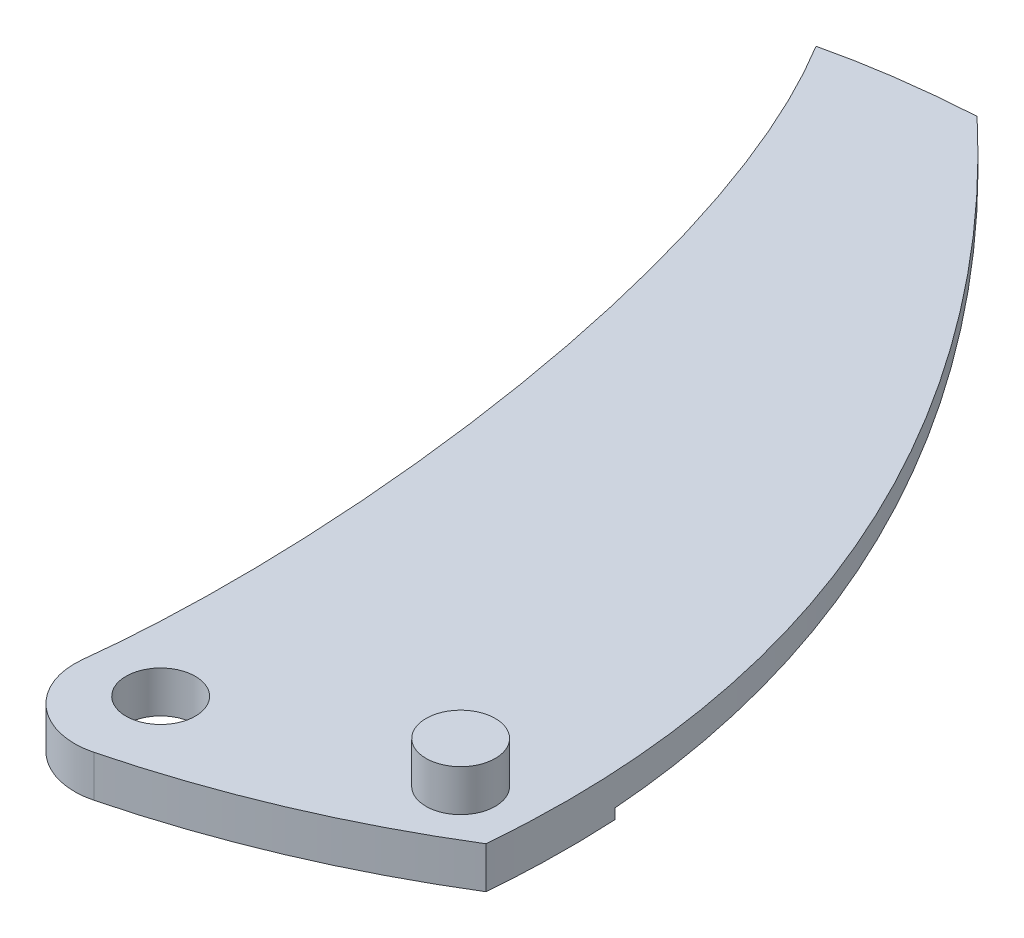
ISO-10303-21;
HEADER;
FILE_DESCRIPTION(('STEP AP214'),'2;1');
FILE_NAME('part.step','',(''),(''),'','','');
FILE_SCHEMA(('AUTOMOTIVE_DESIGN { 1 0 10303 214 1 1 1 1 }'));
ENDSEC;
DATA;
#1=APPLICATION_CONTEXT('core data for automotive mechanical design processes');
#2=APPLICATION_PROTOCOL_DEFINITION('international standard','automotive_design',2000,#1);
#3=PRODUCT_CONTEXT('',#1,'mechanical');
#4=PRODUCT('Part','Part','',(#3));
#5=PRODUCT_RELATED_PRODUCT_CATEGORY('part','',(#4));
#6=PRODUCT_DEFINITION_FORMATION('','',#4);
#7=PRODUCT_DEFINITION_CONTEXT('part definition',#1,'design');
#8=PRODUCT_DEFINITION('design','',#6,#7);
#9=PRODUCT_DEFINITION_SHAPE('','',#8);
#10=(LENGTH_UNIT() NAMED_UNIT(*) SI_UNIT(.MILLI.,.METRE.));
#11=(NAMED_UNIT(*) PLANE_ANGLE_UNIT() SI_UNIT($,.RADIAN.));
#12=(NAMED_UNIT(*) SI_UNIT($,.STERADIAN.) SOLID_ANGLE_UNIT());
#13=UNCERTAINTY_MEASURE_WITH_UNIT(LENGTH_MEASURE(1.E-05),#10,'distance_accuracy_value','');
#14=(GEOMETRIC_REPRESENTATION_CONTEXT(3) GLOBAL_UNCERTAINTY_ASSIGNED_CONTEXT((#13)) GLOBAL_UNIT_ASSIGNED_CONTEXT((#10,
#11,#12)) REPRESENTATION_CONTEXT('',''));
#15=CARTESIAN_POINT('',(0.,0.,0.));
#16=DIRECTION('',(0.,0.,1.));
#17=DIRECTION('',(1.,0.,0.));
#18=AXIS2_PLACEMENT_3D('',#15,#16,#17);
#19=CARTESIAN_POINT('',(71.4794551048972,3.,12.1217778360679));
#20=CARTESIAN_POINT('',(58.9107047890441,3.,3.5514220776926));
#21=CARTESIAN_POINT('',(21.9997651748603,3.,-5.2665547097315));
#22=CARTESIAN_POINT('',(0.,3.,0.));
#23=B_SPLINE_CURVE_WITH_KNOTS('',3,(#19,#20,#21,#22),.UNSPECIFIED.,.F.,.F.,(4,4),(0.,1.),.UNSPECIFIED.);
#24=DIRECTION('',(0.,-1.,0.));
#25=VECTOR('',#24,1.);
#26=SURFACE_OF_LINEAR_EXTRUSION('',#23,#25);
#27=DIRECTION('',(0.,-1.,0.));
#28=VECTOR('',#27,1.);
#29=CARTESIAN_POINT('',(10.1931672449815,3.,-1.4345166800925));
#30=LINE('',#29,#28);
#31=CARTESIAN_POINT('',(10.1931672449815,3.,-1.4345166800925));
#32=VERTEX_POINT('',#31);
#33=CARTESIAN_POINT('',(10.1931672449815,2.10209144228475,-1.4345166800925));
#34=VERTEX_POINT('',#33);
#35=EDGE_CURVE('E160',#32,#34,#30,.T.);
#36=ORIENTED_EDGE('',*,*,#35,.T.);
#37=CARTESIAN_POINT('',(10.1931672449815,2.10209144228475,-1.4345166800925));
#38=CARTESIAN_POINT('',(9.90692039832597,2.10367755123326,-1.41713215946707));
#39=CARTESIAN_POINT('',(9.62076804639066,2.10522849014687,-1.39816139672349));
#40=CARTESIAN_POINT('',(9.04895945208246,2.10825553745138,-1.35693790100129));
#41=CARTESIAN_POINT('',(8.76330299505411,2.10973171215057,-1.33468814715529));
#42=CARTESIAN_POINT('',(8.19249703971551,2.11260650393517,-1.28678478235274));
#43=CARTESIAN_POINT('',(7.90734732017477,2.1140051801361,-1.26113381795258));
#44=CARTESIAN_POINT('',(7.33756806562223,2.11672194824518,-1.2062931287519));
#45=CARTESIAN_POINT('',(7.05293831644787,2.11804009018199,-1.17710563520134));
#46=CARTESIAN_POINT('',(6.48421299035874,2.12059251124431,-1.11504565281189));
#47=CARTESIAN_POINT('',(6.20011722724809,2.12182682888212,-1.08217487487338));
#48=CARTESIAN_POINT('',(5.63247521431374,2.12420801963402,-1.01258858400911));
#49=CARTESIAN_POINT('',(5.34892883472212,2.12535491673213,-0.975874132212568));
#50=CARTESIAN_POINT('',(4.78230618758182,2.12755772444539,-0.898412704500658));
#51=CARTESIAN_POINT('',(4.49923007197513,2.12861360977443,-0.857664614618894));
#52=CARTESIAN_POINT('',(3.93367503862076,2.13062961598989,-0.771956441903124));
#53=CARTESIAN_POINT('',(3.65119620837073,2.13158972368433,-0.726995780497404));
#54=CARTESIAN_POINT('',(3.08687374691885,2.13340940577572,-0.632655322279301));
#55=CARTESIAN_POINT('',(2.80503037421245,2.13426894467751,-0.583273976001156));
#56=CARTESIAN_POINT('',(2.24202084593436,2.13588224735871,-0.479864539609075));
#57=CARTESIAN_POINT('',(1.96085519917364,2.13663594725666,-0.425833674632493));
#58=CARTESIAN_POINT('',(1.39924587185873,2.13803184090457,-0.312875975151369));
#59=CARTESIAN_POINT('',(1.11880305812395,2.13867393467325,-0.253944819915658));
#60=CARTESIAN_POINT('',(0.558694015598184,2.13984014851565,-0.13090658385292));
#61=CARTESIAN_POINT('',(0.279029166921443,2.14036412245871,-0.0667932236235317));
#62=CARTESIAN_POINT('',(0.,2.1408254117339,0.));
#63=B_SPLINE_CURVE_WITH_KNOTS('',3,(#37,#38,#39,#40,#41,#42,#43,#44,#45,#46,#47,#48,#49,#50,#51,
#52,#53,#54,#55,#56,#57,#58,#59,#60,#61,#62),.UNSPECIFIED.,.F.,.F.,(4,2,2,2,2,2,2,2,2,2,2,2,4),
(0.,0.860333968960625,1.71989104478459,2.57878316300538,3.43713618750278,4.29509214356341,
5.15281186383974,6.01076912422509,6.8688443931673,7.72722160699478,8.58611470668649,
9.44577331569672,10.3064896757358),.UNSPECIFIED.);
#64=CARTESIAN_POINT('',(0.,2.1408254117339,0.));
#65=VERTEX_POINT('',#64);
#66=EDGE_CURVE('E51',#34,#65,#63,.T.);
#67=ORIENTED_EDGE('',*,*,#66,.T.);
#68=DIRECTION('',(0.,-1.,0.));
#69=VECTOR('',#68,1.);
#70=CARTESIAN_POINT('',(0.,3.,0.));
#71=LINE('',#70,#69);
#72=CARTESIAN_POINT('',(0.,3.,0.));
#73=VERTEX_POINT('',#72);
#74=EDGE_CURVE('E112',#73,#65,#71,.T.);
#75=ORIENTED_EDGE('',*,*,#74,.F.);
#76=EDGE_CURVE('E185',#32,#73,#23,.T.);
#77=ORIENTED_EDGE('',*,*,#76,.F.);
#78=EDGE_LOOP('',(#36,#67,#75,#77));
#79=FACE_BOUND('',#78,.T.);
#80=ADVANCED_FACE('F36',(#79),#26,.F.);
#81=CARTESIAN_POINT('',(0.,3.,0.));
#82=DIRECTION('',(0.,-1.,0.));
#83=DIRECTION('',(0.,0.,-1.));
#84=AXIS2_PLACEMENT_3D('',#81,#82,#83);
#85=CYLINDRICAL_SURFACE('',#84,72.5000000000001);
#86=CARTESIAN_POINT('',(0.,3.,0.));
#87=DIRECTION('',(0.,1.,0.));
#88=DIRECTION('',(0.,0.,1.));
#89=AXIS2_PLACEMENT_3D('',#86,#87,#88);
#90=CIRCLE('',#89,72.5000000000001);
#91=CARTESIAN_POINT('',(18.083195819629,3.,70.2086036675631));
#92=VERTEX_POINT('',#91);
#93=CARTESIAN_POINT('',(37.9434213472885,3.,61.7782063227976));
#94=VERTEX_POINT('',#93);
#95=EDGE_CURVE('E212',#92,#94,#90,.T.);
#96=ORIENTED_EDGE('',*,*,#95,.F.);
#97=DIRECTION('',(0.,-1.,0.));
#98=VECTOR('',#97,1.);
#99=CARTESIAN_POINT('',(18.083195819629,3.,70.2086036675632));
#100=LINE('',#99,#98);
#101=CARTESIAN_POINT('',(18.083195819629,0.,70.2086036675631));
#102=VERTEX_POINT('',#101);
#103=EDGE_CURVE('E216',#92,#102,#100,.T.);
#104=ORIENTED_EDGE('',*,*,#103,.T.);
#105=CARTESIAN_POINT('',(0.,0.,0.));
#106=DIRECTION('',(0.,1.,0.));
#107=DIRECTION('',(0.,0.,1.));
#108=AXIS2_PLACEMENT_3D('',#105,#106,#107);
#109=CIRCLE('',#108,72.5000000000001);
#110=CARTESIAN_POINT('',(37.9434213472885,0.,61.7782063227976));
#111=VERTEX_POINT('',#110);
#112=EDGE_CURVE('E190',#102,#111,#109,.T.);
#113=ORIENTED_EDGE('',*,*,#112,.T.);
#114=DIRECTION('',(0.,-1.,0.));
#115=VECTOR('',#114,1.);
#116=CARTESIAN_POINT('',(37.9434213472885,3.,61.7782063227976));
#117=LINE('',#116,#115);
#118=EDGE_CURVE('E175',#94,#111,#117,.T.);
#119=ORIENTED_EDGE('',*,*,#118,.F.);
#120=EDGE_LOOP('',(#96,#104,#113,#119));
#121=FACE_BOUND('',#120,.T.);
#122=ADVANCED_FACE('F200',(#121),#85,.T.);
#123=CARTESIAN_POINT('',(0.,3.,0.));
#124=CARTESIAN_POINT('',(11.807092486405,3.,19.2955651194016));
#125=CARTESIAN_POINT('',(14.8268058213161,3.,57.124859445366));
#126=CARTESIAN_POINT('',(10.5598705759996,3.,71.726836912122));
#127=B_SPLINE_CURVE_WITH_KNOTS('',3,(#123,#124,#125,#126),.UNSPECIFIED.,.F.,.F.,(4,4),(0.,1.),.UNSPECIFIED.);
#128=DIRECTION('',(0.,-1.,0.));
#129=VECTOR('',#128,1.);
#130=SURFACE_OF_LINEAR_EXTRUSION('',#127,#129);
#131=CARTESIAN_POINT('',(0.,2.1408254117339,0.));
#132=CARTESIAN_POINT('',(0.233535392051835,2.13091587937405,0.381693395828129));
#133=CARTESIAN_POINT('',(0.461361045431381,2.12097031466973,0.766842965516234));
#134=CARTESIAN_POINT('',(0.906253979580875,2.10102026730141,1.54324189597357));
#135=CARTESIAN_POINT('',(1.12332268789033,2.09101579265349,1.93449043824838));
#136=CARTESIAN_POINT('',(1.5463213454344,2.0710106065702,2.72032710619366));
#137=CARTESIAN_POINT('',(1.75230337220908,2.06101014637549,3.11488726536788));
#138=CARTESIAN_POINT('',(2.15494092107235,2.04097016826586,3.90874328399484));
#139=CARTESIAN_POINT('',(2.35159609859652,2.03093064892276,4.30803931772617));
#140=CARTESIAN_POINT('',(2.92729419467228,2.00082396135815,5.5098810777136));
#141=CARTESIAN_POINT('',(3.29330514960729,1.98070981106136,6.3186951040227));
#142=CARTESIAN_POINT('',(3.99376166237956,1.94043459677746,7.9484326544608));
#143=CARTESIAN_POINT('',(4.32825074239748,1.92027363805558,8.76933761742042));
#144=CARTESIAN_POINT('',(4.96920412190492,1.87991874704595,10.4215000021659));
#145=CARTESIAN_POINT('',(5.27568273928688,1.85972483703602,11.2527518852908));
#146=CARTESIAN_POINT('',(5.86337333647683,1.81931757465653,12.9241166064289));
#147=CARTESIAN_POINT('',(6.14458507615121,1.79910422210403,13.7642295285717));
#148=CARTESIAN_POINT('',(6.6789802601708,1.75904145586643,15.436571073126));
#149=CARTESIAN_POINT('',(6.93257862574357,1.73919207156767,16.2686675038364));
#150=CARTESIAN_POINT('',(7.41929327140305,1.69948967139856,17.9394860622787));
#151=CARTESIAN_POINT('',(7.65239418839193,1.67963666379389,18.7782126548138));
#152=CARTESIAN_POINT('',(8.09944209154704,1.6399372484716,20.4614025872679));
#153=CARTESIAN_POINT('',(8.31337491281711,1.62009085625817,21.305869681543));
#154=CARTESIAN_POINT('',(8.72315226211431,1.58041535724542,22.9997135859302));
#155=CARTESIAN_POINT('',(8.91898577205838,1.56058626815986,23.849093056553));
#156=CARTESIAN_POINT('',(9.2934187329762,1.52095635539544,25.5519878155883));
#157=CARTESIAN_POINT('',(9.47201139377166,1.50115554585456,26.4055045955873));
#158=CARTESIAN_POINT('',(9.81262965283597,1.46159373918554,28.1159330650802));
#159=CARTESIAN_POINT('',(9.97465326224513,1.4418327471153,28.9728451493346));
#160=CARTESIAN_POINT('',(10.3846471378576,1.38929400680823,31.2576783052344));
#161=CARTESIAN_POINT('',(10.618526000882,1.35655748373855,32.6881486958657));
#162=CARTESIAN_POINT('',(11.0436702748458,1.29125824559274,35.5545408557131));
#163=CARTESIAN_POINT('',(11.2349599748733,1.2586954418392,36.9904590402676));
#164=CARTESIAN_POINT('',(11.5755265106384,1.19376691369301,39.8664880942547));
#165=CARTESIAN_POINT('',(11.7248258685636,1.16140109279511,41.3065962958856));
#166=CARTESIAN_POINT('',(11.9808139722754,1.09689465191806,44.1899017108545));
#167=CARTESIAN_POINT('',(12.0875243415169,1.06475392581778,45.6330969816411));
#168=CARTESIAN_POINT('',(12.2149103461904,1.01640304212638,47.814618537176));
#169=CARTESIAN_POINT('',(12.2521267018248,1.00009980965316,48.5520055948867));
#170=CARTESIAN_POINT('',(12.3144113031645,0.967565398937802,50.0272996551161));
#171=CARTESIAN_POINT('',(12.339479608633,0.951334220341584,50.7652066550591));
#172=CARTESIAN_POINT('',(12.3768300187655,0.918949629250544,52.2414793588664));
#173=CARTESIAN_POINT('',(12.389109854404,0.902796231062004,52.9798451208818));
#174=CARTESIAN_POINT('',(12.4000162730226,0.87058040290477,54.4567021365828));
#175=CARTESIAN_POINT('',(12.3986425705318,0.854517974845123,55.1951933925695));
#176=CARTESIAN_POINT('',(12.3810999326524,0.82248507207443,56.6726162426764));
#177=CARTESIAN_POINT('',(12.3649188181934,0.806514683948743,57.4115476988088));
#178=CARTESIAN_POINT('',(12.3162431810305,0.774697965718702,58.8888545024718));
#179=CARTESIAN_POINT('',(12.283749642816,0.758851628186239,59.62722988087));
#180=CARTESIAN_POINT('',(12.2211879204451,0.735175082845236,60.7348799035284));
#181=CARTESIAN_POINT('',(12.1979947634719,0.727289113284991,61.1045487901329));
#182=CARTESIAN_POINT('',(12.1466608224893,0.711558625390473,61.8435420932023));
#183=CARTESIAN_POINT('',(12.1185200998195,0.703714106543539,62.2128665138808));
#184=CARTESIAN_POINT('',(12.0569084621923,0.688069657178793,62.9511473755315));
#185=CARTESIAN_POINT('',(12.0234365000448,0.680269735733493,63.320103729849));
#186=CARTESIAN_POINT('',(11.9506865943158,0.664721860708533,64.0574594094292));
#187=CARTESIAN_POINT('',(11.9114084013425,0.656973909376067,64.4258587100781));
#188=CARTESIAN_POINT('',(11.8689886239095,0.649255190200581,64.7939054806642));
#189=B_SPLINE_CURVE_WITH_KNOTS('',3,(#131,#132,#133,#134,#135,#136,#137,#138,#139,#140,#141,
#142,#143,#144,#145,#146,#147,#148,#149,#150,#151,#152,#153,#154,#155,#156,#157,#158,#159,#160,
#161,#162,#163,#164,#165,#166,#167,#168,#169,#170,#171,#172,#173,#174,#175,#176,#177,#178,#179,
#180,#181,#182,#183,#184,#185,#186,#187,#188),.UNSPECIFIED.,.F.,.F.,(4,2,2,2,2,2,2,2,2,2,2,2,2,
2,2,2,2,2,2,2,2,2,2,2,2,2,2,2,4),(0.,1.34264124719525,2.68510383450149,4.02058175692909,
5.35610897792443,8.01929741385333,10.678753199672,13.3368418786128,15.9949558170613,
18.6049970727659,21.2169782034502,23.8308738924971,26.4463504699742,29.0628529662871,
31.679669165725,36.0284556570042,40.374755595953,44.7187198625817,49.0604757796145,
51.275911130083,53.4913355814513,55.7071530429954,57.9230168334034,60.1407048076051,
62.3582589557146,63.4696708684468,64.581069002913,65.692685713864,66.8043501853528),.UNSPECIFIED.);
#190=CARTESIAN_POINT('',(12.2188043690712,0.734616998796878,60.7612751308307));
#191=VERTEX_POINT('',#190);
#192=EDGE_CURVE('E107',#65,#191,#189,.T.);
#193=ORIENTED_EDGE('',*,*,#192,.T.);
#194=DIRECTION('',(0.,-1.,0.));
#195=VECTOR('',#194,1.);
#196=CARTESIAN_POINT('',(12.2188043690713,3.,60.7612751308307));
#197=LINE('',#196,#195);
#198=CARTESIAN_POINT('',(12.2188043673755,0.,60.7612751313654));
#199=VERTEX_POINT('',#198);
#200=EDGE_CURVE('E95',#191,#199,#197,.T.);
#201=ORIENTED_EDGE('',*,*,#200,.T.);
#202=CARTESIAN_POINT('',(0.,0.,0.));
#203=CARTESIAN_POINT('',(11.807092486405,0.,19.2955651194016));
#204=CARTESIAN_POINT('',(14.8268058213161,0.,57.124859445366));
#205=CARTESIAN_POINT('',(10.5598705759996,0.,71.726836912122));
#206=B_SPLINE_CURVE_WITH_KNOTS('',3,(#202,#203,#204,#205),.UNSPECIFIED.,.F.,.F.,(4,4),(0.,1.),.UNSPECIFIED.);
#207=CARTESIAN_POINT('',(11.8689886239097,0.,64.7939054806627));
#208=VERTEX_POINT('',#207);
#209=EDGE_CURVE('E182',#199,#208,#206,.T.);
#210=ORIENTED_EDGE('',*,*,#209,.T.);
#211=DIRECTION('',(0.,-1.,0.));
#212=VECTOR('',#211,1.);
#213=CARTESIAN_POINT('',(11.8689886239097,0.,64.7939054806627));
#214=LINE('',#213,#212);
#215=CARTESIAN_POINT('',(11.8689886239097,3.,64.7939054806627));
#216=VERTEX_POINT('',#215);
#217=EDGE_CURVE('E59',#208,#216,#214,.F.);
#218=ORIENTED_EDGE('',*,*,#217,.T.);
#219=EDGE_CURVE('E189',#73,#216,#127,.T.);
#220=ORIENTED_EDGE('',*,*,#219,.F.);
#221=ORIENTED_EDGE('',*,*,#74,.T.);
#222=EDGE_LOOP('',(#193,#201,#210,#218,#220,#221));
#223=FACE_BOUND('',#222,.T.);
#224=ADVANCED_FACE('F110',(#223),#130,.F.);
#225=CARTESIAN_POINT('',(39.2763581245763,3.,0.872047492493901));
#226=DIRECTION('',(0.,1.,0.));
#227=DIRECTION('',(0.,0.,1.));
#228=AXIS2_PLACEMENT_3D('',#225,#226,#227);
#229=PLANE('',#228);
#230=CARTESIAN_POINT('',(33.4475103766686,3.,59.1027899619872));
#231=DIRECTION('',(0.,1.,0.));
#232=DIRECTION('',(0.,0.,1.));
#233=AXIS2_PLACEMENT_3D('',#230,#231,#232);
#234=CIRCLE('',#233,2.5);
#235=CARTESIAN_POINT('',(33.4475103766686,3.,61.6027899619872));
#236=VERTEX_POINT('',#235);
#237=EDGE_CURVE('E104',#236,#236,#234,.T.);
#238=ORIENTED_EDGE('',*,*,#237,.F.);
#239=EDGE_LOOP('',(#238));
#240=FACE_BOUND('',#239,.T.);
#241=CARTESIAN_POINT('',(16.9803675792799,3.,64.2955450779643));
#242=DIRECTION('',(0.,1.,0.));
#243=DIRECTION('',(0.,0.,1.));
#244=AXIS2_PLACEMENT_3D('',#241,#242,#243);
#245=CIRCLE('',#244,2.5);
#246=CARTESIAN_POINT('',(16.9803675792799,3.,66.7955450779643));
#247=VERTEX_POINT('',#246);
#248=EDGE_CURVE('E179',#247,#247,#245,.T.);
#249=ORIENTED_EDGE('',*,*,#248,.F.);
#250=EDGE_LOOP('',(#249));
#251=FACE_BOUND('',#250,.T.);
#252=ORIENTED_EDGE('',*,*,#219,.T.);
#253=CARTESIAN_POINT('',(16.8360788665512,3.,65.3666310008346));
#254=DIRECTION('',(0.,1.,0.));
#255=DIRECTION('',(0.,0.,1.));
#256=AXIS2_PLACEMENT_3D('',#253,#254,#255);
#257=CIRCLE('',#256,5.);
#258=EDGE_CURVE('E141',#216,#92,#257,.T.);
#259=ORIENTED_EDGE('',*,*,#258,.T.);
#260=ORIENTED_EDGE('',*,*,#95,.T.);
#261=CARTESIAN_POINT('',(10.1931672449818,3.,-1.43451668009251));
#262=CARTESIAN_POINT('',(25.4704578422988,3.,12.9854209509694));
#263=CARTESIAN_POINT('',(40.313498200273,3.,34.9778924190391));
#264=CARTESIAN_POINT('',(37.9434213472885,3.,61.7782063227976));
#265=B_SPLINE_CURVE_WITH_KNOTS('',3,(#261,#262,#263,#264),.UNSPECIFIED.,.F.,.F.,(4,4),(0.,1.),.UNSPECIFIED.);
#266=EDGE_CURVE('E153',#32,#94,#265,.T.);
#267=ORIENTED_EDGE('',*,*,#266,.F.);
#268=ORIENTED_EDGE('',*,*,#76,.T.);
#269=EDGE_LOOP('',(#252,#259,#260,#267,#268));
#270=FACE_BOUND('',#269,.T.);
#271=ADVANCED_FACE('F210',(#240,#251,#270),#229,.T.);
#272=CARTESIAN_POINT('',(39.2763581245763,0.,0.872047492493901));
#273=DIRECTION('',(0.,1.,0.));
#274=DIRECTION('',(0.,0.,1.));
#275=AXIS2_PLACEMENT_3D('',#272,#273,#274);
#276=PLANE('',#275);
#277=ORIENTED_EDGE('',*,*,#209,.F.);
#278=DIRECTION('',(0.953705573605431,0.,-0.300741880811331));
#279=VECTOR('',#278,1.);
#280=CARTESIAN_POINT('',(54.0065001422378,0.,47.5839271427259));
#281=LINE('',#280,#279);
#282=CARTESIAN_POINT('',(38.0968384489708,0.,52.6008859538366));
#283=VERTEX_POINT('',#282);
#284=EDGE_CURVE('E101',#199,#283,#281,.T.);
#285=ORIENTED_EDGE('',*,*,#284,.T.);
#286=CARTESIAN_POINT('',(10.1931672449818,0.,-1.43451668009251));
#287=CARTESIAN_POINT('',(25.4704578422988,0.,12.9854209509694));
#288=CARTESIAN_POINT('',(40.313498200273,0.,34.9778924190391));
#289=CARTESIAN_POINT('',(37.9434213472885,0.,61.7782063227976));
#290=B_SPLINE_CURVE_WITH_KNOTS('',3,(#286,#287,#288,#289),.UNSPECIFIED.,.F.,.F.,(4,4),(0.,1.),.UNSPECIFIED.);
#291=EDGE_CURVE('E161',#283,#111,#290,.T.);
#292=ORIENTED_EDGE('',*,*,#291,.T.);
#293=ORIENTED_EDGE('',*,*,#112,.F.);
#294=CARTESIAN_POINT('',(16.8360788665512,0.,65.3666310008346));
#295=DIRECTION('',(0.,1.,0.));
#296=DIRECTION('',(0.,0.,1.));
#297=AXIS2_PLACEMENT_3D('',#294,#295,#296);
#298=CIRCLE('',#297,5.);
#299=EDGE_CURVE('E228',#102,#208,#298,.F.);
#300=ORIENTED_EDGE('',*,*,#299,.T.);
#301=EDGE_LOOP('',(#277,#285,#292,#293,#300));
#302=FACE_BOUND('',#301,.T.);
#303=CARTESIAN_POINT('',(16.9803675792799,0.,64.2955450779643));
#304=DIRECTION('',(0.,1.,0.));
#305=DIRECTION('',(0.,0.,1.));
#306=AXIS2_PLACEMENT_3D('',#303,#304,#305);
#307=CIRCLE('',#306,2.5);
#308=CARTESIAN_POINT('',(16.9803675792799,0.,66.7955450779643));
#309=VERTEX_POINT('',#308);
#310=EDGE_CURVE('E178',#309,#309,#307,.T.);
#311=ORIENTED_EDGE('',*,*,#310,.T.);
#312=EDGE_LOOP('',(#311));
#313=FACE_BOUND('',#312,.T.);
#314=ADVANCED_FACE('F232',(#302,#313),#276,.F.);
#315=CARTESIAN_POINT('',(16.9803675792799,3.,64.2955450779643));
#316=DIRECTION('',(0.,-1.,0.));
#317=DIRECTION('',(0.,0.,-1.));
#318=AXIS2_PLACEMENT_3D('',#315,#316,#317);
#319=CYLINDRICAL_SURFACE('',#318,2.5);
#320=ORIENTED_EDGE('',*,*,#248,.T.);
#321=EDGE_LOOP('',(#320));
#322=FACE_BOUND('',#321,.T.);
#323=ORIENTED_EDGE('',*,*,#310,.F.);
#324=EDGE_LOOP('',(#323));
#325=FACE_BOUND('',#324,.T.);
#326=ADVANCED_FACE('F149',(#322,#325),#319,.F.);
#327=DIRECTION('',(0.,-1.,0.));
#328=VECTOR('',#327,1.);
#329=SURFACE_OF_LINEAR_EXTRUSION('',#265,#328);
#330=DIRECTION('',(0.,-1.,0.));
#331=VECTOR('',#330,1.);
#332=CARTESIAN_POINT('',(38.0968384489708,3.,52.6008859538366));
#333=LINE('',#332,#331);
#334=CARTESIAN_POINT('',(38.0968384489708,0.734616998796878,52.6008859538366));
#335=VERTEX_POINT('',#334);
#336=EDGE_CURVE('E11',#335,#283,#333,.T.);
#337=ORIENTED_EDGE('',*,*,#336,.F.);
#338=CARTESIAN_POINT('',(10.1931672449818,2.10209144228475,-1.43451668009251));
#339=CARTESIAN_POINT('',(10.9992509829266,2.07999996792284,-0.67361862514961));
#340=CARTESIAN_POINT('',(11.7943059638388,2.05772928319015,0.098991841678595));
#341=CARTESIAN_POINT('',(13.3612518714292,2.01283875314544,1.66756103750188));
#342=CARTESIAN_POINT('',(14.1331394827986,1.9902188585554,2.46352307624126));
#343=CARTESIAN_POINT('',(15.6524230023759,1.94464519286582,4.07851178418793));
#344=CARTESIAN_POINT('',(16.3998186138013,1.92169141772534,4.89753873266155));
#345=CARTESIAN_POINT('',(17.8763741095978,1.87521947305234,6.56727664422945));
#346=CARTESIAN_POINT('',(18.6052598641311,1.85169790741641,7.41823010026367));
#347=CARTESIAN_POINT('',(20.034869226231,1.8043394765965,9.14350548271825));
#348=CARTESIAN_POINT('',(20.7355924077835,1.78050260665016,10.0178277623051));
#349=CARTESIAN_POINT('',(22.1071240731945,1.73252463568028,11.78988485288));
#350=CARTESIAN_POINT('',(22.7779272502684,1.70838348165338,12.6876237727815));
#351=CARTESIAN_POINT('',(24.1228770791979,1.65850431540046,14.5554218706259));
#352=CARTESIAN_POINT('',(24.7952414559295,1.63275056742464,15.5267661193095));
#353=CARTESIAN_POINT('',(26.1018316321926,1.58094823032278,17.4950290083816));
#354=CARTESIAN_POINT('',(26.7360510639668,1.55489959282678,18.4919518793497));
#355=CARTESIAN_POINT('',(27.9634713934547,1.50253885838161,20.5108382112207));
#356=CARTESIAN_POINT('',(28.556670092657,1.47622674739792,21.5328030102796));
#357=CARTESIAN_POINT('',(29.6991466872532,1.42337041764271,23.6012478126533));
#358=CARTESIAN_POINT('',(30.2484172640777,1.39682616100877,24.647731863561));
#359=CARTESIAN_POINT('',(31.2965818896931,1.34371613825585,26.7575740657999));
#360=CARTESIAN_POINT('',(31.7957672760122,1.31715152679898,27.8207872906738));
#361=CARTESIAN_POINT('',(32.7445281788182,1.26388456347692,29.9691868175182));
#362=CARTESIAN_POINT('',(33.1941026335436,1.23718220867658,31.0543735891734));
#363=CARTESIAN_POINT('',(34.0404620130751,1.18370123699395,33.2448979958911));
#364=CARTESIAN_POINT('',(34.4372584328205,1.15692263801947,34.3502311832824));
#365=CARTESIAN_POINT('',(35.1751496690542,1.1033502784322,36.5791591903402));
#366=CARTESIAN_POINT('',(35.5162552055643,1.07655652173591,37.7027504495899));
#367=CARTESIAN_POINT('',(36.0830982706501,1.02791209858283,39.7591813938284));
#368=CARTESIAN_POINT('',(36.3185273474553,1.00605285646163,40.689358988462));
#369=CARTESIAN_POINT('',(36.7490864320176,0.962409075815606,42.5589895201637));
#370=CARTESIAN_POINT('',(36.9442178075556,0.940624534779965,43.4984421412852));
#371=CARTESIAN_POINT('',(37.2930322230241,0.897175062556139,45.3849217232294));
#372=CARTESIAN_POINT('',(37.4467194837413,0.875510119408061,46.3319479026168));
#373=CARTESIAN_POINT('',(37.7117641805979,0.832343590640935,48.2318423927841));
#374=CARTESIAN_POINT('',(37.8231248401507,0.810841992704482,49.1847102530684));
#375=CARTESIAN_POINT('',(38.0040008595039,0.767783880276969,51.1061648662806));
#376=CARTESIAN_POINT('',(38.072988582897,0.746229901889944,52.0748014719523));
#377=CARTESIAN_POINT('',(38.1666293760841,0.703377030094302,54.014334201887));
#378=CARTESIAN_POINT('',(38.1912768521116,0.682078169206794,54.9852305957669));
#379=CARTESIAN_POINT('',(38.1962017983754,0.639774414083326,56.9275074626208));
#380=CARTESIAN_POINT('',(38.176464150184,0.618769622465109,57.8988879878277));
#381=CARTESIAN_POINT('',(38.1137932044533,0.587516134998393,59.3547279919656));
#382=CARTESIAN_POINT('',(38.0873791827345,0.577137496731407,59.839949045342));
#383=CARTESIAN_POINT('',(38.0235968764038,0.55647108718145,60.8096701950189));
#384=CARTESIAN_POINT('',(37.9862286507984,0.54618331540932,61.2941702951889));
#385=CARTESIAN_POINT('',(37.9434213472885,0.535942970502596,61.7782063227976));
#386=B_SPLINE_CURVE_WITH_KNOTS('',3,(#338,#339,#340,#341,#342,#343,#344,#345,#346,#347,#348,
#349,#350,#351,#352,#353,#354,#355,#356,#357,#358,#359,#360,#361,#362,#363,#364,#365,#366,#367,
#368,#369,#370,#371,#372,#373,#374,#375,#376,#377,#378,#379,#380,#381,#382,#383,#384,#385),
.UNSPECIFIED.,.F.,.F.,(4,2,2,2,2,2,2,2,2,2,2,2,2,2,2,2,2,2,2,2,2,2,2,4),(0.,3.32603004187186,
6.65253379937675,9.97907785099821,13.3405755458953,16.702124070923,20.0642664677933,
23.608293176509,27.1529098774232,30.6977164055277,34.243112285066,37.7665171870313,
41.2899974814588,44.8127091086759,48.3347418423272,51.2131754469341,54.091511335964,
56.9695539762779,59.8473773932168,62.7603456978971,65.6736814638107,68.5880097182835,
70.0460537584793,71.5040899448504),.UNSPECIFIED.);
#387=EDGE_CURVE('E44',#34,#335,#386,.T.);
#388=ORIENTED_EDGE('',*,*,#387,.F.);
#389=ORIENTED_EDGE('',*,*,#35,.F.);
#390=ORIENTED_EDGE('',*,*,#266,.T.);
#391=ORIENTED_EDGE('',*,*,#118,.T.);
#392=ORIENTED_EDGE('',*,*,#291,.F.);
#393=EDGE_LOOP('',(#337,#388,#389,#390,#391,#392));
#394=FACE_BOUND('',#393,.T.);
#395=ADVANCED_FACE('F143',(#394),#329,.T.);
#396=CARTESIAN_POINT('',(16.8360788665512,1.5,65.3666310008346));
#397=DIRECTION('',(0.,-1.,0.));
#398=DIRECTION('',(0.,0.,-1.));
#399=AXIS2_PLACEMENT_3D('',#396,#397,#398);
#400=CYLINDRICAL_SURFACE('',#399,5.);
#401=ORIENTED_EDGE('',*,*,#258,.F.);
#402=ORIENTED_EDGE('',*,*,#217,.F.);
#403=ORIENTED_EDGE('',*,*,#299,.F.);
#404=ORIENTED_EDGE('',*,*,#103,.F.);
#405=EDGE_LOOP('',(#401,#402,#403,#404));
#406=FACE_BOUND('',#405,.T.);
#407=ADVANCED_FACE('F38',(#406),#400,.T.);
#408=CARTESIAN_POINT('',(33.4475103766686,6.,59.1027899619872));
#409=DIRECTION('',(0.,-1.,0.));
#410=DIRECTION('',(0.,0.,-1.));
#411=AXIS2_PLACEMENT_3D('',#408,#409,#410);
#412=CYLINDRICAL_SURFACE('',#411,2.5);
#413=CARTESIAN_POINT('',(33.4475103766686,6.,59.1027899619872));
#414=DIRECTION('',(0.,1.,0.));
#415=DIRECTION('',(0.,0.,1.));
#416=AXIS2_PLACEMENT_3D('',#413,#414,#415);
#417=CIRCLE('',#416,2.5);
#418=CARTESIAN_POINT('',(33.4475103766686,6.,61.6027899619872));
#419=VERTEX_POINT('',#418);
#420=EDGE_CURVE('E169',#419,#419,#417,.T.);
#421=ORIENTED_EDGE('',*,*,#420,.F.);
#422=EDGE_LOOP('',(#421));
#423=FACE_BOUND('',#422,.T.);
#424=ORIENTED_EDGE('',*,*,#237,.T.);
#425=EDGE_LOOP('',(#424));
#426=FACE_BOUND('',#425,.T.);
#427=ADVANCED_FACE('F151',(#423,#426),#412,.T.);
#428=CARTESIAN_POINT('',(33.4475103766686,6.,59.1027899619872));
#429=DIRECTION('',(0.,1.,0.));
#430=DIRECTION('',(0.,0.,1.));
#431=AXIS2_PLACEMENT_3D('',#428,#429,#430);
#432=PLANE('',#431);
#433=ORIENTED_EDGE('',*,*,#420,.T.);
#434=EDGE_LOOP('',(#433));
#435=FACE_BOUND('',#434,.T.);
#436=ADVANCED_FACE('F240',(#435),#432,.T.);
#437=CARTESIAN_POINT('',(-1.64986250648885,-3.98176436568476,65.1346258545074));
#438=DIRECTION('',(0.300741880811331,0.,0.953705573605431));
#439=DIRECTION('',(0.953705573605431,0.,-0.300741880811331));
#440=AXIS2_PLACEMENT_3D('',#437,#438,#439);
#441=PLANE('',#440);
#442=DIRECTION('',(0.953705573605431,0.,-0.300741880811331));
#443=VECTOR('',#442,1.);
#444=CARTESIAN_POINT('',(-1.64986250648885,0.734616998796878,65.1346258545074));
#445=LINE('',#444,#443);
#446=EDGE_CURVE('E98',#191,#335,#445,.T.);
#447=ORIENTED_EDGE('',*,*,#446,.T.);
#448=ORIENTED_EDGE('',*,*,#336,.T.);
#449=ORIENTED_EDGE('',*,*,#284,.F.);
#450=ORIENTED_EDGE('',*,*,#200,.F.);
#451=EDGE_LOOP('',(#447,#448,#449,#450));
#452=FACE_BOUND('',#451,.T.);
#453=ADVANCED_FACE('F97',(#452),#441,.F.);
#454=CARTESIAN_POINT('',(-1.64986250648885,0.734616998796878,65.1346258545074));
#455=DIRECTION('',(0.00686099663199773,0.999739736591658,0.0217574310261406));
#456=DIRECTION('',(0.,-0.0217579431409855,0.999763267934101));
#457=AXIS2_PLACEMENT_3D('',#454,#455,#456);
#458=PLANE('',#457);
#459=ORIENTED_EDGE('',*,*,#66,.F.);
#460=ORIENTED_EDGE('',*,*,#387,.T.);
#461=ORIENTED_EDGE('',*,*,#446,.F.);
#462=ORIENTED_EDGE('',*,*,#192,.F.);
#463=EDGE_LOOP('',(#459,#460,#461,#462));
#464=FACE_BOUND('',#463,.T.);
#465=ADVANCED_FACE('F106',(#464),#458,.F.);
#466=CLOSED_SHELL('',(#80,#122,#224,#271,#314,#326,#395,#407,#427,#436,#453,#465));
#467=MANIFOLD_SOLID_BREP('B2',#466);
#468=ADVANCED_BREP_SHAPE_REPRESENTATION('',(#18,#467),#14);
#469=SHAPE_DEFINITION_REPRESENTATION(#9,#468);
ENDSEC;
END-ISO-10303-21;
